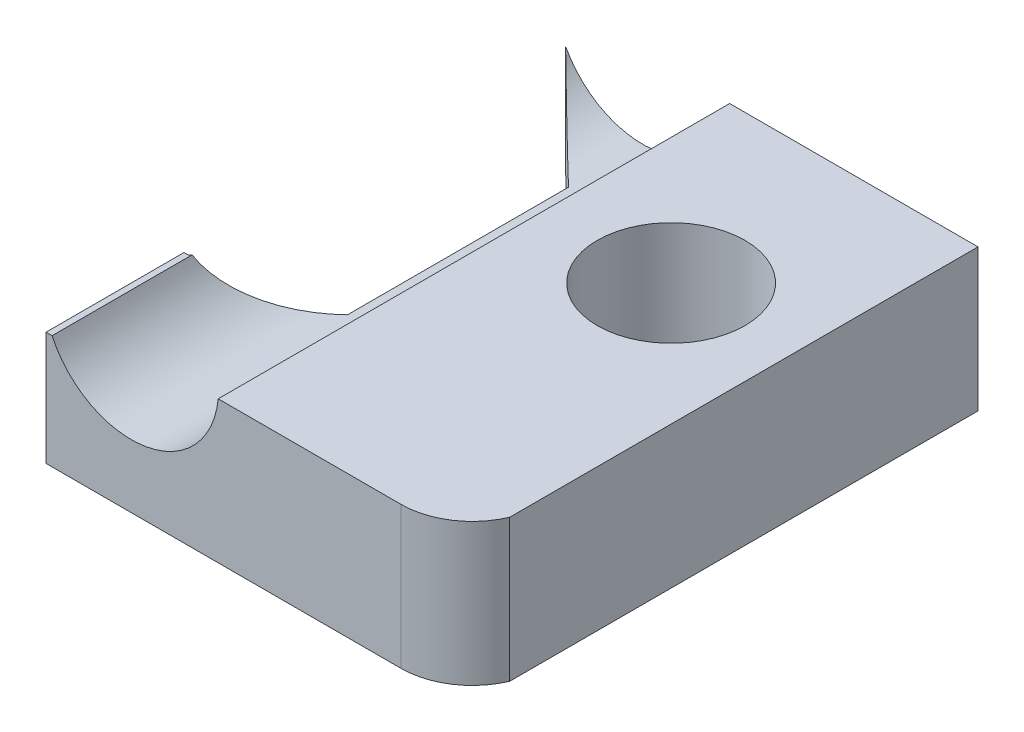
ISO-10303-21;
HEADER;
FILE_DESCRIPTION(('STEP AP214'),'2;1');
FILE_NAME('part.step','',(''),(''),'','','');
FILE_SCHEMA(('AUTOMOTIVE_DESIGN { 1 0 10303 214 1 1 1 1 }'));
ENDSEC;
DATA;
#1=APPLICATION_CONTEXT('core data for automotive mechanical design processes');
#2=APPLICATION_PROTOCOL_DEFINITION('international standard','automotive_design',2000,#1);
#3=PRODUCT_CONTEXT('',#1,'mechanical');
#4=PRODUCT('Part','Part','',(#3));
#5=PRODUCT_RELATED_PRODUCT_CATEGORY('part','',(#4));
#6=PRODUCT_DEFINITION_FORMATION('','',#4);
#7=PRODUCT_DEFINITION_CONTEXT('part definition',#1,'design');
#8=PRODUCT_DEFINITION('design','',#6,#7);
#9=PRODUCT_DEFINITION_SHAPE('','',#8);
#10=(LENGTH_UNIT() NAMED_UNIT(*) SI_UNIT(.MILLI.,.METRE.));
#11=(NAMED_UNIT(*) PLANE_ANGLE_UNIT() SI_UNIT($,.RADIAN.));
#12=(NAMED_UNIT(*) SI_UNIT($,.STERADIAN.) SOLID_ANGLE_UNIT());
#13=UNCERTAINTY_MEASURE_WITH_UNIT(LENGTH_MEASURE(1.E-05),#10,'distance_accuracy_value','');
#14=(GEOMETRIC_REPRESENTATION_CONTEXT(3) GLOBAL_UNCERTAINTY_ASSIGNED_CONTEXT((#13)) GLOBAL_UNIT_ASSIGNED_CONTEXT((#10,
#11,#12)) REPRESENTATION_CONTEXT('',''));
#15=CARTESIAN_POINT('',(0.,0.,0.));
#16=DIRECTION('',(0.,0.,1.));
#17=DIRECTION('',(1.,0.,0.));
#18=AXIS2_PLACEMENT_3D('',#15,#16,#17);
#19=CARTESIAN_POINT('',(0.,-0.0001,0.));
#20=DIRECTION('',(-1.,0.,0.));
#21=DIRECTION('',(0.,0.,1.));
#22=AXIS2_PLACEMENT_3D('',#19,#20,#21);
#23=PLANE('',#22);
#24=DIRECTION('',(0.,1.,0.));
#25=VECTOR('',#24,1.);
#26=CARTESIAN_POINT('',(0.,-0.0001,-4.85591877694527));
#27=LINE('',#26,#25);
#28=CARTESIAN_POINT('',(0.,-0.0001,-4.85591877694527));
#29=VERTEX_POINT('',#28);
#30=CARTESIAN_POINT('',(0.,4.,-4.85591877694527));
#31=VERTEX_POINT('',#30);
#32=EDGE_CURVE('E186',#29,#31,#27,.T.);
#33=ORIENTED_EDGE('',*,*,#32,.F.);
#34=DIRECTION('',(0.,0.,1.));
#35=VECTOR('',#34,1.);
#36=CARTESIAN_POINT('',(0.,-0.0001,0.));
#37=LINE('',#36,#35);
#38=CARTESIAN_POINT('',(0.,-0.0001,0.));
#39=VERTEX_POINT('',#38);
#40=EDGE_CURVE('E144',#29,#39,#37,.T.);
#41=ORIENTED_EDGE('',*,*,#40,.T.);
#42=DIRECTION('',(0.,1.,0.));
#43=VECTOR('',#42,1.);
#44=CARTESIAN_POINT('',(0.,-0.0001,0.));
#45=LINE('',#44,#43);
#46=CARTESIAN_POINT('',(0.,4.,0.));
#47=VERTEX_POINT('',#46);
#48=EDGE_CURVE('E156',#39,#47,#45,.T.);
#49=ORIENTED_EDGE('',*,*,#48,.T.);
#50=DIRECTION('',(0.,0.,1.));
#51=VECTOR('',#50,1.);
#52=CARTESIAN_POINT('',(0.,4.,-18.));
#53=LINE('',#52,#51);
#54=EDGE_CURVE('E189',#31,#47,#53,.T.);
#55=ORIENTED_EDGE('',*,*,#54,.F.);
#56=EDGE_LOOP('',(#33,#41,#49,#55));
#57=FACE_BOUND('',#56,.T.);
#58=ADVANCED_FACE('F34',(#57),#23,.T.);
#59=CARTESIAN_POINT('',(0.,-0.0001,-18.));
#60=DIRECTION('',(0.,0.,-1.));
#61=DIRECTION('',(-1.,0.,0.));
#62=AXIS2_PLACEMENT_3D('',#59,#60,#61);
#63=PLANE('',#62);
#64=DIRECTION('',(0.,-1.,0.));
#65=VECTOR('',#64,1.);
#66=CARTESIAN_POINT('',(14.8,5.,-18.));
#67=LINE('',#66,#65);
#68=CARTESIAN_POINT('',(14.8,5.,-18.));
#69=VERTEX_POINT('',#68);
#70=CARTESIAN_POINT('',(14.8,-0.0001,-18.));
#71=VERTEX_POINT('',#70);
#72=EDGE_CURVE('E115',#69,#71,#67,.T.);
#73=ORIENTED_EDGE('',*,*,#72,.T.);
#74=DIRECTION('',(-1.,0.,0.));
#75=VECTOR('',#74,1.);
#76=CARTESIAN_POINT('',(0.,-0.0001,-18.));
#77=LINE('',#76,#75);
#78=CARTESIAN_POINT('',(0.288353584088665,-0.0001,-18.));
#79=VERTEX_POINT('',#78);
#80=EDGE_CURVE('E154',#71,#79,#77,.T.);
#81=ORIENTED_EDGE('',*,*,#80,.T.);
#82=DIRECTION('',(0.,-1.,0.));
#83=VECTOR('',#82,1.);
#84=CARTESIAN_POINT('',(0.288353584088668,-0.0001,-18.));
#85=LINE('',#84,#83);
#86=CARTESIAN_POINT('',(0.288353584088668,3.84996596071841,-18.));
#87=VERTEX_POINT('',#86);
#88=EDGE_CURVE('E182',#87,#79,#85,.T.);
#89=ORIENTED_EDGE('',*,*,#88,.F.);
#90=CARTESIAN_POINT('',(3.,5.29999999999998,-18.));
#91=DIRECTION('',(0.,0.,1.));
#92=DIRECTION('',(1.,0.,0.));
#93=AXIS2_PLACEMENT_3D('',#90,#91,#92);
#94=CIRCLE('',#93,3.075);
#95=CARTESIAN_POINT('',(6.06033086446548,5.,-18.));
#96=VERTEX_POINT('',#95);
#97=EDGE_CURVE('E138',#87,#96,#94,.T.);
#98=ORIENTED_EDGE('',*,*,#97,.T.);
#99=DIRECTION('',(-1.,0.,0.));
#100=VECTOR('',#99,1.);
#101=CARTESIAN_POINT('',(0.,5.,-18.));
#102=LINE('',#101,#100);
#103=EDGE_CURVE('E130',#69,#96,#102,.T.);
#104=ORIENTED_EDGE('',*,*,#103,.F.);
#105=EDGE_LOOP('',(#73,#81,#89,#98,#104));
#106=FACE_BOUND('',#105,.T.);
#107=ADVANCED_FACE('F135',(#106),#63,.T.);
#108=CARTESIAN_POINT('',(0.,-0.0001,0.));
#109=DIRECTION('',(0.,0.,1.));
#110=DIRECTION('',(1.,0.,0.));
#111=AXIS2_PLACEMENT_3D('',#108,#109,#110);
#112=PLANE('',#111);
#113=DIRECTION('',(1.,0.,0.));
#114=VECTOR('',#113,1.);
#115=CARTESIAN_POINT('',(0.,4.,0.));
#116=LINE('',#115,#114);
#117=CARTESIAN_POINT('',(0.213312898798996,4.,0.));
#118=VERTEX_POINT('',#117);
#119=EDGE_CURVE('E185',#47,#118,#116,.T.);
#120=ORIENTED_EDGE('',*,*,#119,.F.);
#121=ORIENTED_EDGE('',*,*,#48,.F.);
#122=DIRECTION('',(1.,0.,0.));
#123=VECTOR('',#122,1.);
#124=CARTESIAN_POINT('',(0.,-0.0001,0.));
#125=LINE('',#124,#123);
#126=CARTESIAN_POINT('',(12.5,-0.0001,0.));
#127=VERTEX_POINT('',#126);
#128=EDGE_CURVE('E151',#39,#127,#125,.T.);
#129=ORIENTED_EDGE('',*,*,#128,.T.);
#130=DIRECTION('',(0.,1.,0.));
#131=VECTOR('',#130,1.);
#132=CARTESIAN_POINT('',(12.5,-0.0001,0.));
#133=LINE('',#132,#131);
#134=CARTESIAN_POINT('',(12.5,5.,0.));
#135=VERTEX_POINT('',#134);
#136=EDGE_CURVE('E159',#127,#135,#133,.T.);
#137=ORIENTED_EDGE('',*,*,#136,.T.);
#138=DIRECTION('',(1.,0.,0.));
#139=VECTOR('',#138,1.);
#140=CARTESIAN_POINT('',(0.,5.,0.));
#141=LINE('',#140,#139);
#142=CARTESIAN_POINT('',(6.06033086446548,5.,0.));
#143=VERTEX_POINT('',#142);
#144=EDGE_CURVE('E141',#143,#135,#141,.T.);
#145=ORIENTED_EDGE('',*,*,#144,.F.);
#146=CARTESIAN_POINT('',(3.,5.29999999999998,0.));
#147=DIRECTION('',(0.,0.,1.));
#148=DIRECTION('',(1.,0.,0.));
#149=AXIS2_PLACEMENT_3D('',#146,#147,#148);
#150=CIRCLE('',#149,3.075);
#151=EDGE_CURVE('E195',#118,#143,#150,.T.);
#152=ORIENTED_EDGE('',*,*,#151,.F.);
#153=EDGE_LOOP('',(#120,#121,#129,#137,#145,#152));
#154=FACE_BOUND('',#153,.T.);
#155=ADVANCED_FACE('F218',(#154),#112,.T.);
#156=CARTESIAN_POINT('',(0.,-0.0001,0.));
#157=DIRECTION('',(0.,-1.,0.));
#158=DIRECTION('',(0.,0.,-1.));
#159=AXIS2_PLACEMENT_3D('',#156,#157,#158);
#160=PLANE('',#159);
#161=DIRECTION('',(0.,0.,-1.));
#162=VECTOR('',#161,1.);
#163=CARTESIAN_POINT('',(14.8,-0.0001,-18.));
#164=LINE('',#163,#162);
#165=CARTESIAN_POINT('',(14.8,-0.0001,-1.52020410288673));
#166=VERTEX_POINT('',#165);
#167=EDGE_CURVE('E118',#166,#71,#164,.T.);
#168=ORIENTED_EDGE('',*,*,#167,.F.);
#169=CARTESIAN_POINT('',(12.5,-0.0001,-2.5));
#170=DIRECTION('',(0.,-1.,0.));
#171=DIRECTION('',(0.,0.,-1.));
#172=AXIS2_PLACEMENT_3D('',#169,#170,#171);
#173=CIRCLE('',#172,2.5);
#174=EDGE_CURVE('E163',#166,#127,#173,.T.);
#175=ORIENTED_EDGE('',*,*,#174,.T.);
#176=ORIENTED_EDGE('',*,*,#128,.F.);
#177=ORIENTED_EDGE('',*,*,#40,.F.);
#178=DIRECTION('',(-1.,0.,0.));
#179=VECTOR('',#178,1.);
#180=CARTESIAN_POINT('',(0.138710494062467,-0.0001,-4.85591877694527));
#181=LINE('',#180,#179);
#182=CARTESIAN_POINT('',(0.138710494062467,-0.0001,-4.85591877694527));
#183=VERTEX_POINT('',#182);
#184=EDGE_CURVE('E246',#183,#29,#181,.T.);
#185=ORIENTED_EDGE('',*,*,#184,.F.);
#186=DIRECTION('',(-0.720406115273639,0.,0.693552470312337));
#187=VECTOR('',#186,1.);
#188=CARTESIAN_POINT('',(3.,-0.0001,-7.61055170280261));
#189=LINE('',#188,#187);
#190=CARTESIAN_POINT('',(3.,-0.0001,-7.61055170280261));
#191=VERTEX_POINT('',#190);
#192=EDGE_CURVE('E248',#191,#183,#189,.T.);
#193=ORIENTED_EDGE('',*,*,#192,.F.);
#194=DIRECTION('',(0.,0.,1.));
#195=VECTOR('',#194,1.);
#196=CARTESIAN_POINT('',(3.,-0.0001,-15.3891388288362));
#197=LINE('',#196,#195);
#198=CARTESIAN_POINT('',(3.,-0.0001,-15.3891388288362));
#199=VERTEX_POINT('',#198);
#200=EDGE_CURVE('E253',#199,#191,#197,.T.);
#201=ORIENTED_EDGE('',*,*,#200,.F.);
#202=DIRECTION('',(0.720367185815203,0.,0.693592904808494));
#203=VECTOR('',#202,1.);
#204=CARTESIAN_POINT('',(0.138718580961699,-0.0001,-18.144073437163));
#205=LINE('',#204,#203);
#206=EDGE_CURVE('E356',#79,#199,#205,.T.);
#207=ORIENTED_EDGE('',*,*,#206,.F.);
#208=ORIENTED_EDGE('',*,*,#80,.F.);
#209=EDGE_LOOP('',(#168,#175,#176,#177,#185,#193,#201,#207,#208));
#210=FACE_BOUND('',#209,.T.);
#211=CARTESIAN_POINT('',(10.5,-0.0001,-11.4995296944433));
#212=DIRECTION('',(0.,1.,0.));
#213=DIRECTION('',(0.,0.,1.));
#214=AXIS2_PLACEMENT_3D('',#211,#212,#213);
#215=CIRCLE('',#214,2.6);
#216=CARTESIAN_POINT('',(10.5,-0.0001,-8.89952969444328));
#217=VERTEX_POINT('',#216);
#218=EDGE_CURVE('E140',#217,#217,#215,.T.);
#219=ORIENTED_EDGE('',*,*,#218,.T.);
#220=EDGE_LOOP('',(#219));
#221=FACE_BOUND('',#220,.T.);
#222=ADVANCED_FACE('F210',(#210,#221),#160,.T.);
#223=CARTESIAN_POINT('',(10.5,-0.0001,-11.4995296944433));
#224=DIRECTION('',(0.,1.,0.));
#225=DIRECTION('',(0.,0.,1.));
#226=AXIS2_PLACEMENT_3D('',#223,#224,#225);
#227=CYLINDRICAL_SURFACE('',#226,2.6);
#228=ORIENTED_EDGE('',*,*,#218,.F.);
#229=EDGE_LOOP('',(#228));
#230=FACE_BOUND('',#229,.T.);
#231=CARTESIAN_POINT('',(10.5,5.,-11.4995296944433));
#232=DIRECTION('',(0.,1.,0.));
#233=DIRECTION('',(0.,0.,1.));
#234=AXIS2_PLACEMENT_3D('',#231,#232,#233);
#235=CIRCLE('',#234,2.6);
#236=CARTESIAN_POINT('',(10.5,5.,-8.89952969444328));
#237=VERTEX_POINT('',#236);
#238=EDGE_CURVE('E146',#237,#237,#235,.T.);
#239=ORIENTED_EDGE('',*,*,#238,.T.);
#240=EDGE_LOOP('',(#239));
#241=FACE_BOUND('',#240,.T.);
#242=ADVANCED_FACE('F202',(#230,#241),#227,.F.);
#243=CARTESIAN_POINT('',(0.,5.,0.));
#244=DIRECTION('',(0.,-1.,0.));
#245=DIRECTION('',(0.,0.,-1.));
#246=AXIS2_PLACEMENT_3D('',#243,#244,#245);
#247=PLANE('',#246);
#248=CARTESIAN_POINT('',(12.5,5.,-2.5));
#249=DIRECTION('',(0.,-1.,0.));
#250=DIRECTION('',(0.,0.,-1.));
#251=AXIS2_PLACEMENT_3D('',#248,#249,#250);
#252=CIRCLE('',#251,2.5);
#253=CARTESIAN_POINT('',(14.8,5.,-1.52020410288673));
#254=VERTEX_POINT('',#253);
#255=EDGE_CURVE('E133',#135,#254,#252,.F.);
#256=ORIENTED_EDGE('',*,*,#255,.T.);
#257=DIRECTION('',(0.,0.,-1.));
#258=VECTOR('',#257,1.);
#259=CARTESIAN_POINT('',(14.8,5.,-18.));
#260=LINE('',#259,#258);
#261=EDGE_CURVE('E49',#254,#69,#260,.T.);
#262=ORIENTED_EDGE('',*,*,#261,.T.);
#263=ORIENTED_EDGE('',*,*,#103,.T.);
#264=DIRECTION('',(0.,0.,1.));
#265=VECTOR('',#264,1.);
#266=CARTESIAN_POINT('',(6.06033086446548,5.,-18.));
#267=LINE('',#266,#265);
#268=EDGE_CURVE('E197',#96,#143,#267,.T.);
#269=ORIENTED_EDGE('',*,*,#268,.T.);
#270=ORIENTED_EDGE('',*,*,#144,.T.);
#271=EDGE_LOOP('',(#256,#262,#263,#269,#270));
#272=FACE_BOUND('',#271,.T.);
#273=ORIENTED_EDGE('',*,*,#238,.F.);
#274=EDGE_LOOP('',(#273));
#275=FACE_BOUND('',#274,.T.);
#276=ADVANCED_FACE('F127',(#272,#275),#247,.F.);
#277=CARTESIAN_POINT('',(3.,5.29999999999998,-18.));
#278=DIRECTION('',(0.,0.,1.));
#279=DIRECTION('',(1.,0.,0.));
#280=AXIS2_PLACEMENT_3D('',#277,#278,#279);
#281=CYLINDRICAL_SURFACE('',#280,3.075);
#282=DIRECTION('',(0.,0.,1.));
#283=VECTOR('',#282,1.);
#284=CARTESIAN_POINT('',(3.,2.22499999999998,-18.));
#285=LINE('',#284,#283);
#286=CARTESIAN_POINT('',(3.,2.22499999999998,-15.3891388288362));
#287=VERTEX_POINT('',#286);
#288=CARTESIAN_POINT('',(3.,2.22499999999998,-7.61055170280261));
#289=VERTEX_POINT('',#288);
#290=EDGE_CURVE('E11',#287,#289,#285,.T.);
#291=ORIENTED_EDGE('',*,*,#290,.T.);
#292=CARTESIAN_POINT('',(3.,5.29999999999998,-7.61055170280261));
#293=DIRECTION('',(0.693552470312337,0.,0.720406115273638));
#294=DIRECTION('',(-0.720406115273638,0.,0.693552470312337));
#295=AXIS2_PLACEMENT_3D('',#292,#293,#294);
#296=ELLIPSE('',#295,4.26842573210528,3.075);
#297=CARTESIAN_POINT('',(0.213312898798996,4.,-4.92774032454084));
#298=VERTEX_POINT('',#297);
#299=EDGE_CURVE('E123',#289,#298,#296,.F.);
#300=ORIENTED_EDGE('',*,*,#299,.T.);
#301=DIRECTION('',(0.,0.,1.));
#302=VECTOR('',#301,1.);
#303=CARTESIAN_POINT('',(0.213312898798996,4.,-18.));
#304=LINE('',#303,#302);
#305=EDGE_CURVE('E165',#298,#118,#304,.T.);
#306=ORIENTED_EDGE('',*,*,#305,.T.);
#307=ORIENTED_EDGE('',*,*,#151,.T.);
#308=ORIENTED_EDGE('',*,*,#268,.F.);
#309=ORIENTED_EDGE('',*,*,#97,.F.);
#310=CARTESIAN_POINT('',(3.,5.29999999999998,-15.3891388288362));
#311=DIRECTION('',(0.693592904808494,0.,-0.720367185815203));
#312=DIRECTION('',(0.720367185815203,0.,0.693592904808494));
#313=AXIS2_PLACEMENT_3D('',#310,#311,#312);
#314=ELLIPSE('',#313,4.26865640266523,3.075);
#315=EDGE_CURVE('E42',#87,#287,#314,.F.);
#316=ORIENTED_EDGE('',*,*,#315,.T.);
#317=EDGE_LOOP('',(#291,#300,#306,#307,#308,#309,#316));
#318=FACE_BOUND('',#317,.T.);
#319=ADVANCED_FACE('F176',(#318),#281,.F.);
#320=CARTESIAN_POINT('',(12.5,-0.0001,-2.5));
#321=DIRECTION('',(0.,1.,0.));
#322=DIRECTION('',(0.,0.,1.));
#323=AXIS2_PLACEMENT_3D('',#320,#321,#322);
#324=CYLINDRICAL_SURFACE('',#323,2.5);
#325=DIRECTION('',(0.,1.,0.));
#326=VECTOR('',#325,1.);
#327=CARTESIAN_POINT('',(14.8,-0.0001,-1.52020410288673));
#328=LINE('',#327,#326);
#329=EDGE_CURVE('E173',#254,#166,#328,.F.);
#330=ORIENTED_EDGE('',*,*,#329,.F.);
#331=ORIENTED_EDGE('',*,*,#255,.F.);
#332=ORIENTED_EDGE('',*,*,#136,.F.);
#333=ORIENTED_EDGE('',*,*,#174,.F.);
#334=EDGE_LOOP('',(#330,#331,#332,#333));
#335=FACE_BOUND('',#334,.T.);
#336=ADVANCED_FACE('F36',(#335),#324,.T.);
#337=CARTESIAN_POINT('',(0.,4.,-18.));
#338=DIRECTION('',(0.,-1.,0.));
#339=DIRECTION('',(0.,0.,-1.));
#340=AXIS2_PLACEMENT_3D('',#337,#338,#339);
#341=PLANE('',#340);
#342=DIRECTION('',(-0.720406115273638,0.,0.693552470312337));
#343=VECTOR('',#342,1.);
#344=CARTESIAN_POINT('',(6.63402322545237,4.,-11.1091141549378));
#345=LINE('',#344,#343);
#346=CARTESIAN_POINT('',(0.138710494062466,4.,-4.85591877694527));
#347=VERTEX_POINT('',#346);
#348=EDGE_CURVE('E167',#298,#347,#345,.T.);
#349=ORIENTED_EDGE('',*,*,#348,.T.);
#350=DIRECTION('',(-1.,0.,0.));
#351=VECTOR('',#350,1.);
#352=CARTESIAN_POINT('',(0.,4.,-4.85591877694527));
#353=LINE('',#352,#351);
#354=EDGE_CURVE('E170',#347,#31,#353,.T.);
#355=ORIENTED_EDGE('',*,*,#354,.T.);
#356=ORIENTED_EDGE('',*,*,#54,.T.);
#357=ORIENTED_EDGE('',*,*,#119,.T.);
#358=ORIENTED_EDGE('',*,*,#305,.F.);
#359=EDGE_LOOP('',(#349,#355,#356,#357,#358));
#360=FACE_BOUND('',#359,.T.);
#361=ADVANCED_FACE('F259',(#360),#341,.F.);
#362=CARTESIAN_POINT('',(3.,5.,-15.3891388288362));
#363=DIRECTION('',(1.,0.,0.));
#364=DIRECTION('',(0.,0.,-1.));
#365=AXIS2_PLACEMENT_3D('',#362,#363,#364);
#366=PLANE('',#365);
#367=DIRECTION('',(0.,-1.,0.));
#368=VECTOR('',#367,1.);
#369=CARTESIAN_POINT('',(3.,5.,-15.3891388288362));
#370=LINE('',#369,#368);
#371=EDGE_CURVE('E184',#287,#199,#370,.T.);
#372=ORIENTED_EDGE('',*,*,#371,.T.);
#373=ORIENTED_EDGE('',*,*,#200,.T.);
#374=DIRECTION('',(0.,-1.,0.));
#375=VECTOR('',#374,1.);
#376=CARTESIAN_POINT('',(3.,5.,-7.61055170280261));
#377=LINE('',#376,#375);
#378=EDGE_CURVE('E251',#289,#191,#377,.T.);
#379=ORIENTED_EDGE('',*,*,#378,.F.);
#380=ORIENTED_EDGE('',*,*,#290,.F.);
#381=EDGE_LOOP('',(#372,#373,#379,#380));
#382=FACE_BOUND('',#381,.T.);
#383=ADVANCED_FACE('F264',(#382),#366,.F.);
#384=CARTESIAN_POINT('',(3.,5.,-7.61055170280261));
#385=DIRECTION('',(0.693552470312337,0.,0.720406115273638));
#386=DIRECTION('',(0.720406115273638,0.,-0.693552470312337));
#387=AXIS2_PLACEMENT_3D('',#384,#385,#386);
#388=PLANE('',#387);
#389=ORIENTED_EDGE('',*,*,#378,.T.);
#390=ORIENTED_EDGE('',*,*,#192,.T.);
#391=DIRECTION('',(0.,-1.,0.));
#392=VECTOR('',#391,1.);
#393=CARTESIAN_POINT('',(0.138710494062467,5.,-4.85591877694527));
#394=LINE('',#393,#392);
#395=EDGE_CURVE('E57',#347,#183,#394,.T.);
#396=ORIENTED_EDGE('',*,*,#395,.F.);
#397=ORIENTED_EDGE('',*,*,#348,.F.);
#398=ORIENTED_EDGE('',*,*,#299,.F.);
#399=EDGE_LOOP('',(#389,#390,#396,#397,#398));
#400=FACE_BOUND('',#399,.T.);
#401=ADVANCED_FACE('F260',(#400),#388,.F.);
#402=CARTESIAN_POINT('',(0.138710494062467,5.,-4.85591877694527));
#403=DIRECTION('',(0.,0.,1.));
#404=DIRECTION('',(1.,0.,0.));
#405=AXIS2_PLACEMENT_3D('',#402,#403,#404);
#406=PLANE('',#405);
#407=ORIENTED_EDGE('',*,*,#32,.T.);
#408=ORIENTED_EDGE('',*,*,#354,.F.);
#409=ORIENTED_EDGE('',*,*,#395,.T.);
#410=ORIENTED_EDGE('',*,*,#184,.T.);
#411=EDGE_LOOP('',(#407,#408,#409,#410));
#412=FACE_BOUND('',#411,.T.);
#413=ADVANCED_FACE('F263',(#412),#406,.F.);
#414=CARTESIAN_POINT('',(0.138718580961699,5.,-18.144073437163));
#415=DIRECTION('',(0.693592904808494,0.,-0.720367185815203));
#416=DIRECTION('',(-0.720367185815203,0.,-0.693592904808494));
#417=AXIS2_PLACEMENT_3D('',#414,#415,#416);
#418=PLANE('',#417);
#419=ORIENTED_EDGE('',*,*,#88,.T.);
#420=ORIENTED_EDGE('',*,*,#206,.T.);
#421=ORIENTED_EDGE('',*,*,#371,.F.);
#422=ORIENTED_EDGE('',*,*,#315,.F.);
#423=EDGE_LOOP('',(#419,#420,#421,#422));
#424=FACE_BOUND('',#423,.T.);
#425=ADVANCED_FACE('F180',(#424),#418,.F.);
#426=CARTESIAN_POINT('',(14.8,5.,-18.));
#427=DIRECTION('',(-1.,0.,0.));
#428=DIRECTION('',(0.,0.,1.));
#429=AXIS2_PLACEMENT_3D('',#426,#427,#428);
#430=PLANE('',#429);
#431=ORIENTED_EDGE('',*,*,#329,.T.);
#432=ORIENTED_EDGE('',*,*,#167,.T.);
#433=ORIENTED_EDGE('',*,*,#72,.F.);
#434=ORIENTED_EDGE('',*,*,#261,.F.);
#435=EDGE_LOOP('',(#431,#432,#433,#434));
#436=FACE_BOUND('',#435,.T.);
#437=ADVANCED_FACE('F116',(#436),#430,.F.);
#438=CLOSED_SHELL('',(#58,#107,#155,#222,#242,#276,#319,#336,#361,#383,#401,#413,#425,#437));
#439=MANIFOLD_SOLID_BREP('B2',#438);
#440=ADVANCED_BREP_SHAPE_REPRESENTATION('',(#18,#439),#14);
#441=SHAPE_DEFINITION_REPRESENTATION(#9,#440);
ENDSEC;
END-ISO-10303-21;
